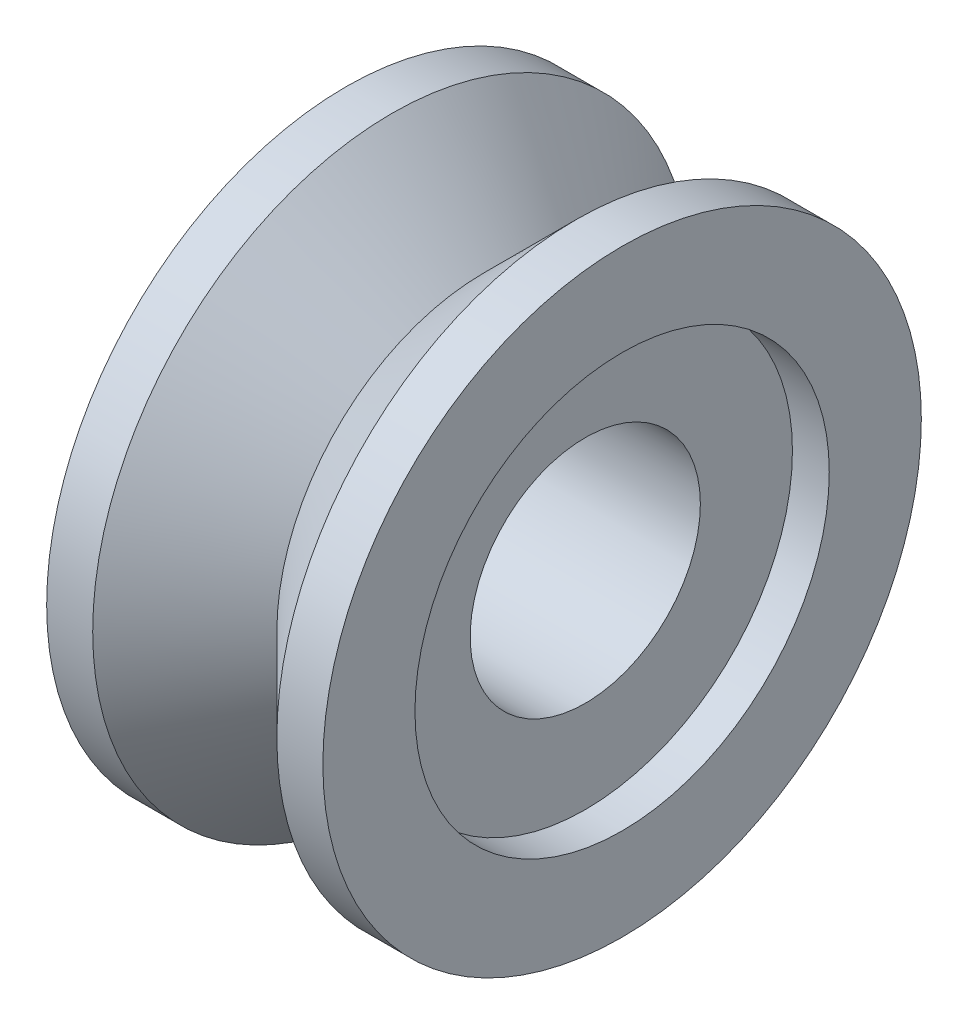
ISO-10303-21;
HEADER;
FILE_DESCRIPTION(('STEP AP214'),'2;1');
FILE_NAME('part.step','',(''),(''),'','','');
FILE_SCHEMA(('AUTOMOTIVE_DESIGN { 1 0 10303 214 1 1 1 1 }'));
ENDSEC;
DATA;
#1=APPLICATION_CONTEXT('core data for automotive mechanical design processes');
#2=APPLICATION_PROTOCOL_DEFINITION('international standard','automotive_design',2000,#1);
#3=PRODUCT_CONTEXT('',#1,'mechanical');
#4=PRODUCT('Part','Part','',(#3));
#5=PRODUCT_RELATED_PRODUCT_CATEGORY('part','',(#4));
#6=PRODUCT_DEFINITION_FORMATION('','',#4);
#7=PRODUCT_DEFINITION_CONTEXT('part definition',#1,'design');
#8=PRODUCT_DEFINITION('design','',#6,#7);
#9=PRODUCT_DEFINITION_SHAPE('','',#8);
#10=(LENGTH_UNIT() NAMED_UNIT(*) SI_UNIT(.MILLI.,.METRE.));
#11=(NAMED_UNIT(*) PLANE_ANGLE_UNIT() SI_UNIT($,.RADIAN.));
#12=(NAMED_UNIT(*) SI_UNIT($,.STERADIAN.) SOLID_ANGLE_UNIT());
#13=UNCERTAINTY_MEASURE_WITH_UNIT(LENGTH_MEASURE(1.E-05),#10,'distance_accuracy_value','');
#14=(GEOMETRIC_REPRESENTATION_CONTEXT(3) GLOBAL_UNCERTAINTY_ASSIGNED_CONTEXT((#13)) GLOBAL_UNIT_ASSIGNED_CONTEXT((#10,
#11,#12)) REPRESENTATION_CONTEXT('',''));
#15=CARTESIAN_POINT('',(0.,0.,0.));
#16=DIRECTION('',(0.,0.,1.));
#17=DIRECTION('',(1.,0.,0.));
#18=AXIS2_PLACEMENT_3D('',#15,#16,#17);
#19=CARTESIAN_POINT('',(-3.,0.,0.));
#20=DIRECTION('',(1.,0.,0.));
#21=DIRECTION('',(0.,0.,-1.));
#22=AXIS2_PLACEMENT_3D('',#19,#20,#21);
#23=PLANE('',#22);
#24=CARTESIAN_POINT('',(-3.,0.,0.));
#25=DIRECTION('',(1.,0.,0.));
#26=DIRECTION('',(0.,0.,-1.));
#27=AXIS2_PLACEMENT_3D('',#24,#25,#26);
#28=CIRCLE('',#27,6.5);
#29=CARTESIAN_POINT('',(-3.,0.,-6.5));
#30=VERTEX_POINT('',#29);
#31=EDGE_CURVE('E50',#30,#30,#28,.T.);
#32=ORIENTED_EDGE('',*,*,#31,.F.);
#33=EDGE_LOOP('',(#32));
#34=FACE_BOUND('',#33,.T.);
#35=CARTESIAN_POINT('',(-3.,0.,0.));
#36=DIRECTION('',(1.,0.,0.));
#37=DIRECTION('',(0.,0.,-1.));
#38=AXIS2_PLACEMENT_3D('',#35,#36,#37);
#39=CIRCLE('',#38,4.5);
#40=CARTESIAN_POINT('',(-3.,0.,-4.5));
#41=VERTEX_POINT('',#40);
#42=EDGE_CURVE('E72',#41,#41,#39,.T.);
#43=ORIENTED_EDGE('',*,*,#42,.T.);
#44=EDGE_LOOP('',(#43));
#45=FACE_BOUND('',#44,.T.);
#46=ADVANCED_FACE('F42',(#34,#45),#23,.F.);
#47=CARTESIAN_POINT('',(3.,0.,0.));
#48=DIRECTION('',(-1.,0.,0.));
#49=DIRECTION('',(0.,0.,1.));
#50=AXIS2_PLACEMENT_3D('',#47,#48,#49);
#51=CYLINDRICAL_SURFACE('',#50,6.5);
#52=CARTESIAN_POINT('',(-2.,0.,0.));
#53=DIRECTION('',(1.,0.,0.));
#54=DIRECTION('',(0.,0.,-1.));
#55=AXIS2_PLACEMENT_3D('',#52,#53,#54);
#56=CIRCLE('',#55,6.5);
#57=CARTESIAN_POINT('',(-2.,0.,-6.5));
#58=VERTEX_POINT('',#57);
#59=EDGE_CURVE('E55',#58,#58,#56,.T.);
#60=ORIENTED_EDGE('',*,*,#59,.F.);
#61=EDGE_LOOP('',(#60));
#62=FACE_BOUND('',#61,.T.);
#63=ORIENTED_EDGE('',*,*,#31,.T.);
#64=EDGE_LOOP('',(#63));
#65=FACE_BOUND('',#64,.T.);
#66=ADVANCED_FACE('F100',(#62,#65),#51,.T.);
#67=CARTESIAN_POINT('',(-2.,0.,0.));
#68=DIRECTION('',(-1.,0.,0.));
#69=DIRECTION('',(0.,0.,1.));
#70=AXIS2_PLACEMENT_3D('',#67,#68,#69);
#71=CONICAL_SURFACE('',#70,6.5,0.785398163397448);
#72=CARTESIAN_POINT('',(0.,0.,0.));
#73=DIRECTION('',(1.,0.,0.));
#74=DIRECTION('',(0.,0.,-1.));
#75=AXIS2_PLACEMENT_3D('',#72,#73,#74);
#76=CIRCLE('',#75,4.5);
#77=CARTESIAN_POINT('',(0.,0.,-4.5));
#78=VERTEX_POINT('',#77);
#79=EDGE_CURVE('E59',#78,#78,#76,.T.);
#80=ORIENTED_EDGE('',*,*,#79,.F.);
#81=EDGE_LOOP('',(#80));
#82=FACE_BOUND('',#81,.T.);
#83=ORIENTED_EDGE('',*,*,#59,.T.);
#84=EDGE_LOOP('',(#83));
#85=FACE_BOUND('',#84,.T.);
#86=ADVANCED_FACE('F105',(#82,#85),#71,.T.);
#87=CARTESIAN_POINT('',(0.,0.,0.));
#88=DIRECTION('',(1.,0.,0.));
#89=DIRECTION('',(0.,0.,-1.));
#90=AXIS2_PLACEMENT_3D('',#87,#88,#89);
#91=CONICAL_SURFACE('',#90,4.5,0.785398163397448);
#92=CARTESIAN_POINT('',(2.,0.,0.));
#93=DIRECTION('',(1.,0.,0.));
#94=DIRECTION('',(0.,0.,-1.));
#95=AXIS2_PLACEMENT_3D('',#92,#93,#94);
#96=CIRCLE('',#95,6.5);
#97=CARTESIAN_POINT('',(2.,0.,-6.5));
#98=VERTEX_POINT('',#97);
#99=EDGE_CURVE('E62',#98,#98,#96,.T.);
#100=ORIENTED_EDGE('',*,*,#99,.F.);
#101=EDGE_LOOP('',(#100));
#102=FACE_BOUND('',#101,.T.);
#103=ORIENTED_EDGE('',*,*,#79,.T.);
#104=EDGE_LOOP('',(#103));
#105=FACE_BOUND('',#104,.T.);
#106=ADVANCED_FACE('F112',(#102,#105),#91,.T.);
#107=CARTESIAN_POINT('',(3.,0.,0.));
#108=DIRECTION('',(1.,0.,0.));
#109=DIRECTION('',(0.,0.,-1.));
#110=AXIS2_PLACEMENT_3D('',#107,#108,#109);
#111=PLANE('',#110);
#112=CARTESIAN_POINT('',(3.,0.,0.));
#113=DIRECTION('',(1.,0.,0.));
#114=DIRECTION('',(0.,0.,-1.));
#115=AXIS2_PLACEMENT_3D('',#112,#113,#114);
#116=CIRCLE('',#115,4.5);
#117=CARTESIAN_POINT('',(3.,0.,-4.5));
#118=VERTEX_POINT('',#117);
#119=EDGE_CURVE('E66',#118,#118,#116,.T.);
#120=ORIENTED_EDGE('',*,*,#119,.F.);
#121=EDGE_LOOP('',(#120));
#122=FACE_BOUND('',#121,.T.);
#123=CARTESIAN_POINT('',(3.,0.,0.));
#124=DIRECTION('',(1.,0.,0.));
#125=DIRECTION('',(0.,0.,-1.));
#126=AXIS2_PLACEMENT_3D('',#123,#124,#125);
#127=CIRCLE('',#126,6.5);
#128=CARTESIAN_POINT('',(3.,0.,-6.5));
#129=VERTEX_POINT('',#128);
#130=EDGE_CURVE('E12',#129,#129,#127,.T.);
#131=ORIENTED_EDGE('',*,*,#130,.T.);
#132=EDGE_LOOP('',(#131));
#133=FACE_BOUND('',#132,.T.);
#134=ADVANCED_FACE('F109',(#122,#133),#111,.T.);
#135=ORIENTED_EDGE('',*,*,#99,.T.);
#136=EDGE_LOOP('',(#135));
#137=FACE_BOUND('',#136,.T.);
#138=ORIENTED_EDGE('',*,*,#130,.F.);
#139=EDGE_LOOP('',(#138));
#140=FACE_BOUND('',#139,.T.);
#141=ADVANCED_FACE('F44',(#137,#140),#51,.T.);
#142=CARTESIAN_POINT('',(2.2,0.,0.));
#143=DIRECTION('',(1.,0.,0.));
#144=DIRECTION('',(0.,0.,-1.));
#145=AXIS2_PLACEMENT_3D('',#142,#143,#144);
#146=CYLINDRICAL_SURFACE('',#145,4.5);
#147=CARTESIAN_POINT('',(2.2,0.,0.));
#148=DIRECTION('',(1.,0.,0.));
#149=DIRECTION('',(0.,0.,-1.));
#150=AXIS2_PLACEMENT_3D('',#147,#148,#149);
#151=CIRCLE('',#150,4.5);
#152=CARTESIAN_POINT('',(2.2,0.,-4.5));
#153=VERTEX_POINT('',#152);
#154=EDGE_CURVE('E65',#153,#153,#151,.T.);
#155=ORIENTED_EDGE('',*,*,#154,.F.);
#156=EDGE_LOOP('',(#155));
#157=FACE_BOUND('',#156,.T.);
#158=ORIENTED_EDGE('',*,*,#119,.T.);
#159=EDGE_LOOP('',(#158));
#160=FACE_BOUND('',#159,.T.);
#161=ADVANCED_FACE('F120',(#157,#160),#146,.F.);
#162=CARTESIAN_POINT('',(2.2,0.,0.));
#163=DIRECTION('',(1.,0.,0.));
#164=DIRECTION('',(0.,0.,-1.));
#165=AXIS2_PLACEMENT_3D('',#162,#163,#164);
#166=PLANE('',#165);
#167=CARTESIAN_POINT('',(2.2,0.,0.));
#168=DIRECTION('',(1.,0.,0.));
#169=DIRECTION('',(0.,0.,-1.));
#170=AXIS2_PLACEMENT_3D('',#167,#168,#169);
#171=CIRCLE('',#170,2.5);
#172=CARTESIAN_POINT('',(2.2,0.,-2.5));
#173=VERTEX_POINT('',#172);
#174=EDGE_CURVE('E75',#173,#173,#171,.T.);
#175=ORIENTED_EDGE('',*,*,#174,.F.);
#176=EDGE_LOOP('',(#175));
#177=FACE_BOUND('',#176,.T.);
#178=ORIENTED_EDGE('',*,*,#154,.T.);
#179=EDGE_LOOP('',(#178));
#180=FACE_BOUND('',#179,.T.);
#181=ADVANCED_FACE('F95',(#177,#180),#166,.T.);
#182=CARTESIAN_POINT('',(-2.2,0.,0.));
#183=DIRECTION('',(-1.,0.,0.));
#184=DIRECTION('',(0.,0.,1.));
#185=AXIS2_PLACEMENT_3D('',#182,#183,#184);
#186=CYLINDRICAL_SURFACE('',#185,4.5);
#187=CARTESIAN_POINT('',(-2.2,0.,0.));
#188=DIRECTION('',(1.,0.,0.));
#189=DIRECTION('',(0.,0.,-1.));
#190=AXIS2_PLACEMENT_3D('',#187,#188,#189);
#191=CIRCLE('',#190,4.5);
#192=CARTESIAN_POINT('',(-2.2,0.,-4.5));
#193=VERTEX_POINT('',#192);
#194=EDGE_CURVE('E69',#193,#193,#191,.T.);
#195=ORIENTED_EDGE('',*,*,#194,.T.);
#196=EDGE_LOOP('',(#195));
#197=FACE_BOUND('',#196,.T.);
#198=ORIENTED_EDGE('',*,*,#42,.F.);
#199=EDGE_LOOP('',(#198));
#200=FACE_BOUND('',#199,.T.);
#201=ADVANCED_FACE('F89',(#197,#200),#186,.F.);
#202=CARTESIAN_POINT('',(-2.2,0.,0.));
#203=DIRECTION('',(-1.,0.,0.));
#204=DIRECTION('',(0.,0.,-1.));
#205=AXIS2_PLACEMENT_3D('',#202,#203,#204);
#206=PLANE('',#205);
#207=CARTESIAN_POINT('',(-2.2,0.,0.));
#208=DIRECTION('',(-1.,0.,0.));
#209=DIRECTION('',(0.,0.,1.));
#210=AXIS2_PLACEMENT_3D('',#207,#208,#209);
#211=CIRCLE('',#210,2.5);
#212=CARTESIAN_POINT('',(-2.2,0.,2.5));
#213=VERTEX_POINT('',#212);
#214=EDGE_CURVE('E46',#213,#213,#211,.T.);
#215=ORIENTED_EDGE('',*,*,#214,.F.);
#216=EDGE_LOOP('',(#215));
#217=FACE_BOUND('',#216,.T.);
#218=ORIENTED_EDGE('',*,*,#194,.F.);
#219=EDGE_LOOP('',(#218));
#220=FACE_BOUND('',#219,.T.);
#221=ADVANCED_FACE('F86',(#217,#220),#206,.T.);
#222=CARTESIAN_POINT('',(-3.,0.,0.));
#223=DIRECTION('',(1.,0.,0.));
#224=DIRECTION('',(0.,0.,-1.));
#225=AXIS2_PLACEMENT_3D('',#222,#223,#224);
#226=CYLINDRICAL_SURFACE('',#225,2.5);
#227=ORIENTED_EDGE('',*,*,#174,.T.);
#228=EDGE_LOOP('',(#227));
#229=FACE_BOUND('',#228,.T.);
#230=ORIENTED_EDGE('',*,*,#214,.T.);
#231=EDGE_LOOP('',(#230));
#232=FACE_BOUND('',#231,.T.);
#233=ADVANCED_FACE('F84',(#229,#232),#226,.F.);
#234=CLOSED_SHELL('',(#46,#66,#86,#106,#134,#141,#161,#181,#201,#221,#233));
#235=MANIFOLD_SOLID_BREP('B2',#234);
#236=ADVANCED_BREP_SHAPE_REPRESENTATION('',(#18,#235),#14);
#237=SHAPE_DEFINITION_REPRESENTATION(#9,#236);
ENDSEC;
END-ISO-10303-21;
